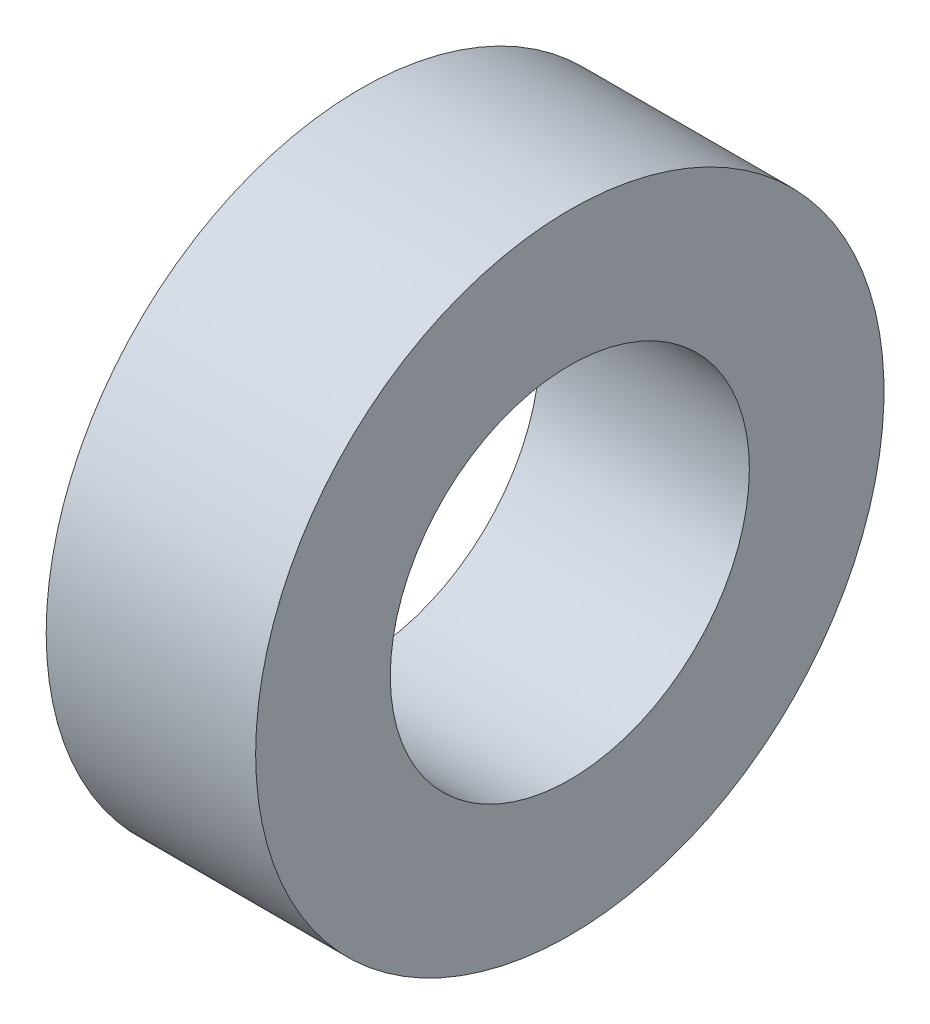
ISO-10303-21;
HEADER;
FILE_DESCRIPTION(('STEP AP214'),'2;1');
FILE_NAME('part.step','',(''),(''),'','','');
FILE_SCHEMA(('AUTOMOTIVE_DESIGN { 1 0 10303 214 1 1 1 1 }'));
ENDSEC;
DATA;
#1=APPLICATION_CONTEXT('core data for automotive mechanical design processes');
#2=APPLICATION_PROTOCOL_DEFINITION('international standard','automotive_design',2000,#1);
#3=PRODUCT_CONTEXT('',#1,'mechanical');
#4=PRODUCT('Part','Part','',(#3));
#5=PRODUCT_RELATED_PRODUCT_CATEGORY('part','',(#4));
#6=PRODUCT_DEFINITION_FORMATION('','',#4);
#7=PRODUCT_DEFINITION_CONTEXT('part definition',#1,'design');
#8=PRODUCT_DEFINITION('design','',#6,#7);
#9=PRODUCT_DEFINITION_SHAPE('','',#8);
#10=(LENGTH_UNIT() NAMED_UNIT(*) SI_UNIT(.MILLI.,.METRE.));
#11=(NAMED_UNIT(*) PLANE_ANGLE_UNIT() SI_UNIT($,.RADIAN.));
#12=(NAMED_UNIT(*) SI_UNIT($,.STERADIAN.) SOLID_ANGLE_UNIT());
#13=UNCERTAINTY_MEASURE_WITH_UNIT(LENGTH_MEASURE(1.E-05),#10,'distance_accuracy_value','');
#14=(GEOMETRIC_REPRESENTATION_CONTEXT(3) GLOBAL_UNCERTAINTY_ASSIGNED_CONTEXT((#13)) GLOBAL_UNIT_ASSIGNED_CONTEXT((#10,
#11,#12)) REPRESENTATION_CONTEXT('',''));
#15=CARTESIAN_POINT('',(0.,0.,0.));
#16=DIRECTION('',(0.,0.,1.));
#17=DIRECTION('',(1.,0.,0.));
#18=AXIS2_PLACEMENT_3D('',#15,#16,#17);
#19=CARTESIAN_POINT('',(-18.6532859052315,0.,0.));
#20=DIRECTION('',(-1.,0.,0.));
#21=DIRECTION('',(0.,0.,1.));
#22=AXIS2_PLACEMENT_3D('',#19,#20,#21);
#23=CYLINDRICAL_SURFACE('',#22,7.2);
#24=CARTESIAN_POINT('',(5.2,0.,0.));
#25=DIRECTION('',(1.,0.,0.));
#26=DIRECTION('',(0.,0.,-1.));
#27=AXIS2_PLACEMENT_3D('',#24,#25,#26);
#28=CIRCLE('',#27,7.2);
#29=CARTESIAN_POINT('',(5.2,0.,-7.2));
#30=VERTEX_POINT('',#29);
#31=EDGE_CURVE('E54',#30,#30,#28,.F.);
#32=ORIENTED_EDGE('',*,*,#31,.T.);
#33=EDGE_LOOP('',(#32));
#34=FACE_BOUND('',#33,.T.);
#35=CARTESIAN_POINT('',(2.25,0.,0.));
#36=DIRECTION('',(-1.,0.,0.));
#37=DIRECTION('',(0.,0.,1.));
#38=AXIS2_PLACEMENT_3D('',#35,#36,#37);
#39=CIRCLE('',#38,7.2);
#40=CARTESIAN_POINT('',(2.25,0.,7.2));
#41=VERTEX_POINT('',#40);
#42=EDGE_CURVE('E59',#41,#41,#39,.T.);
#43=ORIENTED_EDGE('',*,*,#42,.F.);
#44=EDGE_LOOP('',(#43));
#45=FACE_BOUND('',#44,.T.);
#46=ADVANCED_FACE('F39',(#34,#45),#23,.T.);
#47=CARTESIAN_POINT('',(1.5,0.,0.));
#48=DIRECTION('',(-1.,0.,0.));
#49=DIRECTION('',(0.,0.,1.));
#50=AXIS2_PLACEMENT_3D('',#47,#48,#49);
#51=TOROIDAL_SURFACE('',#50,7.2,0.75);
#52=CARTESIAN_POINT('',(0.750000000000001,0.,0.));
#53=DIRECTION('',(-1.,0.,0.));
#54=DIRECTION('',(0.,0.,1.));
#55=AXIS2_PLACEMENT_3D('',#52,#53,#54);
#56=CIRCLE('',#55,7.2);
#57=CARTESIAN_POINT('',(0.750000000000001,0.,7.2));
#58=VERTEX_POINT('',#57);
#59=EDGE_CURVE('E62',#58,#58,#56,.T.);
#60=ORIENTED_EDGE('',*,*,#59,.F.);
#61=EDGE_LOOP('',(#60));
#62=FACE_BOUND('',#61,.T.);
#63=ORIENTED_EDGE('',*,*,#42,.T.);
#64=EDGE_LOOP('',(#63));
#65=FACE_BOUND('',#64,.T.);
#66=ADVANCED_FACE('F119',(#62,#65),#51,.T.);
#67=CARTESIAN_POINT('',(0.,0.,0.));
#68=DIRECTION('',(-1.,0.,0.));
#69=DIRECTION('',(0.,0.,1.));
#70=AXIS2_PLACEMENT_3D('',#67,#68,#69);
#71=CIRCLE('',#70,7.2);
#72=CARTESIAN_POINT('',(0.,0.,7.2));
#73=VERTEX_POINT('',#72);
#74=EDGE_CURVE('E65',#73,#73,#71,.T.);
#75=ORIENTED_EDGE('',*,*,#74,.F.);
#76=EDGE_LOOP('',(#75));
#77=FACE_BOUND('',#76,.T.);
#78=ORIENTED_EDGE('',*,*,#59,.T.);
#79=EDGE_LOOP('',(#78));
#80=FACE_BOUND('',#79,.T.);
#81=ADVANCED_FACE('F113',(#77,#80),#23,.T.);
#82=CARTESIAN_POINT('',(0.,0.,0.));
#83=DIRECTION('',(1.,0.,0.));
#84=DIRECTION('',(0.,0.,-1.));
#85=AXIS2_PLACEMENT_3D('',#82,#83,#84);
#86=PLANE('',#85);
#87=CARTESIAN_POINT('',(0.,0.,0.));
#88=DIRECTION('',(-1.,0.,0.));
#89=DIRECTION('',(0.,0.,1.));
#90=AXIS2_PLACEMENT_3D('',#87,#88,#89);
#91=CIRCLE('',#90,6.);
#92=CARTESIAN_POINT('',(0.,0.,6.));
#93=VERTEX_POINT('',#92);
#94=EDGE_CURVE('E68',#93,#93,#91,.T.);
#95=ORIENTED_EDGE('',*,*,#94,.F.);
#96=EDGE_LOOP('',(#95));
#97=FACE_BOUND('',#96,.T.);
#98=ORIENTED_EDGE('',*,*,#74,.T.);
#99=EDGE_LOOP('',(#98));
#100=FACE_BOUND('',#99,.T.);
#101=ADVANCED_FACE('F107',(#97,#100),#86,.F.);
#102=CARTESIAN_POINT('',(-18.6532859052315,0.,0.));
#103=DIRECTION('',(-1.,0.,0.));
#104=DIRECTION('',(0.,0.,1.));
#105=AXIS2_PLACEMENT_3D('',#102,#103,#104);
#106=CYLINDRICAL_SURFACE('',#105,6.);
#107=CARTESIAN_POINT('',(7.,0.,0.));
#108=DIRECTION('',(-1.,0.,0.));
#109=DIRECTION('',(0.,0.,1.));
#110=AXIS2_PLACEMENT_3D('',#107,#108,#109);
#111=CIRCLE('',#110,6.);
#112=CARTESIAN_POINT('',(7.,0.,6.));
#113=VERTEX_POINT('',#112);
#114=EDGE_CURVE('E71',#113,#113,#111,.T.);
#115=ORIENTED_EDGE('',*,*,#114,.F.);
#116=EDGE_LOOP('',(#115));
#117=FACE_BOUND('',#116,.T.);
#118=ORIENTED_EDGE('',*,*,#94,.T.);
#119=EDGE_LOOP('',(#118));
#120=FACE_BOUND('',#119,.T.);
#121=ADVANCED_FACE('F101',(#117,#120),#106,.F.);
#122=CARTESIAN_POINT('',(7.,0.,0.));
#123=DIRECTION('',(-1.,0.,0.));
#124=DIRECTION('',(0.,0.,1.));
#125=AXIS2_PLACEMENT_3D('',#122,#123,#124);
#126=PLANE('',#125);
#127=CARTESIAN_POINT('',(7.,0.,0.));
#128=DIRECTION('',(-1.,0.,0.));
#129=DIRECTION('',(0.,0.,1.));
#130=AXIS2_PLACEMENT_3D('',#127,#128,#129);
#131=CIRCLE('',#130,10.5);
#132=CARTESIAN_POINT('',(7.,0.,10.5));
#133=VERTEX_POINT('',#132);
#134=EDGE_CURVE('E74',#133,#133,#131,.T.);
#135=ORIENTED_EDGE('',*,*,#134,.F.);
#136=EDGE_LOOP('',(#135));
#137=FACE_BOUND('',#136,.T.);
#138=ORIENTED_EDGE('',*,*,#114,.T.);
#139=EDGE_LOOP('',(#138));
#140=FACE_BOUND('',#139,.T.);
#141=ADVANCED_FACE('F95',(#137,#140),#126,.F.);
#142=CARTESIAN_POINT('',(-18.6532859052315,0.,0.));
#143=DIRECTION('',(-1.,0.,0.));
#144=DIRECTION('',(0.,0.,1.));
#145=AXIS2_PLACEMENT_3D('',#142,#143,#144);
#146=CYLINDRICAL_SURFACE('',#145,10.5);
#147=CARTESIAN_POINT('',(0.,0.,0.));
#148=DIRECTION('',(-1.,0.,0.));
#149=DIRECTION('',(0.,0.,1.));
#150=AXIS2_PLACEMENT_3D('',#147,#148,#149);
#151=CIRCLE('',#150,10.5);
#152=CARTESIAN_POINT('',(0.,0.,10.5));
#153=VERTEX_POINT('',#152);
#154=EDGE_CURVE('E77',#153,#153,#151,.T.);
#155=ORIENTED_EDGE('',*,*,#154,.F.);
#156=EDGE_LOOP('',(#155));
#157=FACE_BOUND('',#156,.T.);
#158=ORIENTED_EDGE('',*,*,#134,.T.);
#159=EDGE_LOOP('',(#158));
#160=FACE_BOUND('',#159,.T.);
#161=ADVANCED_FACE('F89',(#157,#160),#146,.T.);
#162=CARTESIAN_POINT('',(0.,0.,0.));
#163=DIRECTION('',(1.,0.,0.));
#164=DIRECTION('',(0.,0.,-1.));
#165=AXIS2_PLACEMENT_3D('',#162,#163,#164);
#166=PLANE('',#165);
#167=CARTESIAN_POINT('',(0.,0.,0.));
#168=DIRECTION('',(-1.,0.,0.));
#169=DIRECTION('',(0.,0.,1.));
#170=AXIS2_PLACEMENT_3D('',#167,#168,#169);
#171=CIRCLE('',#170,9.3);
#172=CARTESIAN_POINT('',(0.,0.,9.3));
#173=VERTEX_POINT('',#172);
#174=EDGE_CURVE('E80',#173,#173,#171,.T.);
#175=ORIENTED_EDGE('',*,*,#174,.F.);
#176=EDGE_LOOP('',(#175));
#177=FACE_BOUND('',#176,.T.);
#178=ORIENTED_EDGE('',*,*,#154,.T.);
#179=EDGE_LOOP('',(#178));
#180=FACE_BOUND('',#179,.T.);
#181=ADVANCED_FACE('F86',(#177,#180),#166,.F.);
#182=CARTESIAN_POINT('',(-18.6532859052315,0.,0.));
#183=DIRECTION('',(-1.,0.,0.));
#184=DIRECTION('',(0.,0.,1.));
#185=AXIS2_PLACEMENT_3D('',#182,#183,#184);
#186=CYLINDRICAL_SURFACE('',#185,9.3);
#187=CARTESIAN_POINT('',(5.2,0.,0.));
#188=DIRECTION('',(1.,0.,0.));
#189=DIRECTION('',(0.,0.,-1.));
#190=AXIS2_PLACEMENT_3D('',#187,#188,#189);
#191=CIRCLE('',#190,9.3);
#192=CARTESIAN_POINT('',(5.2,0.,-9.3));
#193=VERTEX_POINT('',#192);
#194=EDGE_CURVE('E10',#193,#193,#191,.T.);
#195=ORIENTED_EDGE('',*,*,#194,.T.);
#196=EDGE_LOOP('',(#195));
#197=FACE_BOUND('',#196,.T.);
#198=ORIENTED_EDGE('',*,*,#174,.T.);
#199=EDGE_LOOP('',(#198));
#200=FACE_BOUND('',#199,.T.);
#201=ADVANCED_FACE('F84',(#197,#200),#186,.F.);
#202=CARTESIAN_POINT('',(5.5,0.,0.));
#203=DIRECTION('',(1.,0.,0.));
#204=DIRECTION('',(0.,0.,-1.));
#205=AXIS2_PLACEMENT_3D('',#202,#203,#204);
#206=PLANE('',#205);
#207=CARTESIAN_POINT('',(5.5,0.,0.));
#208=DIRECTION('',(1.,0.,0.));
#209=DIRECTION('',(0.,0.,-1.));
#210=AXIS2_PLACEMENT_3D('',#207,#208,#209);
#211=CIRCLE('',#210,7.5);
#212=CARTESIAN_POINT('',(5.5,0.,-7.5));
#213=VERTEX_POINT('',#212);
#214=EDGE_CURVE('E46',#213,#213,#211,.T.);
#215=ORIENTED_EDGE('',*,*,#214,.T.);
#216=EDGE_LOOP('',(#215));
#217=FACE_BOUND('',#216,.T.);
#218=CARTESIAN_POINT('',(5.5,0.,0.));
#219=DIRECTION('',(1.,0.,0.));
#220=DIRECTION('',(0.,0.,-1.));
#221=AXIS2_PLACEMENT_3D('',#218,#219,#220);
#222=CIRCLE('',#221,9.);
#223=CARTESIAN_POINT('',(5.5,0.,-9.));
#224=VERTEX_POINT('',#223);
#225=EDGE_CURVE('E50',#224,#224,#222,.F.);
#226=ORIENTED_EDGE('',*,*,#225,.T.);
#227=EDGE_LOOP('',(#226));
#228=FACE_BOUND('',#227,.T.);
#229=ADVANCED_FACE('F134',(#217,#228),#206,.F.);
#230=CARTESIAN_POINT('',(5.2,0.,0.));
#231=DIRECTION('',(1.,0.,0.));
#232=DIRECTION('',(0.,0.,-1.));
#233=AXIS2_PLACEMENT_3D('',#230,#231,#232);
#234=TOROIDAL_SURFACE('',#233,7.5,0.3);
#235=ORIENTED_EDGE('',*,*,#214,.F.);
#236=EDGE_LOOP('',(#235));
#237=FACE_BOUND('',#236,.T.);
#238=ORIENTED_EDGE('',*,*,#31,.F.);
#239=EDGE_LOOP('',(#238));
#240=FACE_BOUND('',#239,.T.);
#241=ADVANCED_FACE('F132',(#237,#240),#234,.F.);
#242=CARTESIAN_POINT('',(5.2,0.,0.));
#243=DIRECTION('',(1.,0.,0.));
#244=DIRECTION('',(0.,0.,-1.));
#245=AXIS2_PLACEMENT_3D('',#242,#243,#244);
#246=TOROIDAL_SURFACE('',#245,9.,0.3);
#247=ORIENTED_EDGE('',*,*,#194,.F.);
#248=EDGE_LOOP('',(#247));
#249=FACE_BOUND('',#248,.T.);
#250=ORIENTED_EDGE('',*,*,#225,.F.);
#251=EDGE_LOOP('',(#250));
#252=FACE_BOUND('',#251,.T.);
#253=ADVANCED_FACE('F41',(#249,#252),#246,.F.);
#254=CLOSED_SHELL('',(#46,#66,#81,#101,#121,#141,#161,#181,#201,#229,#241,#253));
#255=MANIFOLD_SOLID_BREP('B2',#254);
#256=ADVANCED_BREP_SHAPE_REPRESENTATION('',(#18,#255),#14);
#257=SHAPE_DEFINITION_REPRESENTATION(#9,#256);
ENDSEC;
END-ISO-10303-21;
